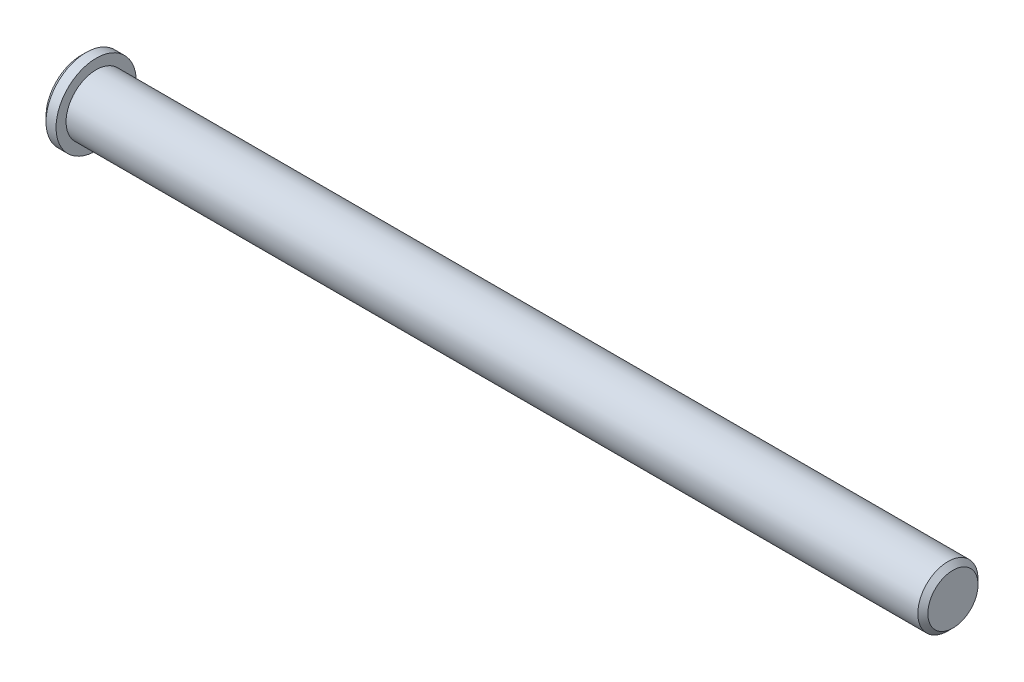
ISO-10303-21;
HEADER;
FILE_DESCRIPTION(('STEP AP214'),'2;1');
FILE_NAME('part.step','',(''),(''),'','','');
FILE_SCHEMA(('AUTOMOTIVE_DESIGN { 1 0 10303 214 1 1 1 1 }'));
ENDSEC;
DATA;
#1=APPLICATION_CONTEXT('core data for automotive mechanical design processes');
#2=APPLICATION_PROTOCOL_DEFINITION('international standard','automotive_design',2000,#1);
#3=PRODUCT_CONTEXT('',#1,'mechanical');
#4=PRODUCT('Part','Part','',(#3));
#5=PRODUCT_RELATED_PRODUCT_CATEGORY('part','',(#4));
#6=PRODUCT_DEFINITION_FORMATION('','',#4);
#7=PRODUCT_DEFINITION_CONTEXT('part definition',#1,'design');
#8=PRODUCT_DEFINITION('design','',#6,#7);
#9=PRODUCT_DEFINITION_SHAPE('','',#8);
#10=(LENGTH_UNIT() NAMED_UNIT(*) SI_UNIT(.MILLI.,.METRE.));
#11=(NAMED_UNIT(*) PLANE_ANGLE_UNIT() SI_UNIT($,.RADIAN.));
#12=(NAMED_UNIT(*) SI_UNIT($,.STERADIAN.) SOLID_ANGLE_UNIT());
#13=UNCERTAINTY_MEASURE_WITH_UNIT(LENGTH_MEASURE(1.E-05),#10,'distance_accuracy_value','');
#14=(GEOMETRIC_REPRESENTATION_CONTEXT(3) GLOBAL_UNCERTAINTY_ASSIGNED_CONTEXT((#13)) GLOBAL_UNIT_ASSIGNED_CONTEXT((#10,
#11,#12)) REPRESENTATION_CONTEXT('',''));
#15=CARTESIAN_POINT('',(0.,0.,0.));
#16=DIRECTION('',(0.,0.,1.));
#17=DIRECTION('',(1.,0.,0.));
#18=AXIS2_PLACEMENT_3D('',#15,#16,#17);
#19=CARTESIAN_POINT('',(0.,0.,0.));
#20=DIRECTION('',(-1.,0.,0.));
#21=DIRECTION('',(0.,-1.,0.));
#22=AXIS2_PLACEMENT_3D('',#19,#20,#21);
#23=PLANE('',#22);
#24=CARTESIAN_POINT('',(0.,0.,0.));
#25=DIRECTION('',(-1.,0.,0.));
#26=DIRECTION('',(0.,-1.,0.));
#27=AXIS2_PLACEMENT_3D('',#24,#25,#26);
#28=CIRCLE('',#27,7.00000000000001);
#29=CARTESIAN_POINT('',(0.,-7.00000000000001,0.));
#30=VERTEX_POINT('',#29);
#31=EDGE_CURVE('E168',#30,#30,#28,.T.);
#32=ORIENTED_EDGE('',*,*,#31,.T.);
#33=EDGE_LOOP('',(#32));
#34=FACE_BOUND('',#33,.T.);
#35=DIRECTION('',(0.,0.5,-0.866025403784439));
#36=VECTOR('',#35,1.);
#37=CARTESIAN_POINT('',(0.,2.5,4.33012701892219));
#38=LINE('',#37,#36);
#39=CARTESIAN_POINT('',(0.,2.5,4.33012701892219));
#40=VERTEX_POINT('',#39);
#41=CARTESIAN_POINT('',(0.,5.,0.));
#42=VERTEX_POINT('',#41);
#43=EDGE_CURVE('E67',#40,#42,#38,.T.);
#44=ORIENTED_EDGE('',*,*,#43,.F.);
#45=DIRECTION('',(0.,1.,0.));
#46=VECTOR('',#45,1.);
#47=CARTESIAN_POINT('',(0.,-2.5,4.33012701892219));
#48=LINE('',#47,#46);
#49=CARTESIAN_POINT('',(0.,-2.5,4.33012701892219));
#50=VERTEX_POINT('',#49);
#51=EDGE_CURVE('E150',#50,#40,#48,.T.);
#52=ORIENTED_EDGE('',*,*,#51,.F.);
#53=DIRECTION('',(0.,0.5,0.866025403784439));
#54=VECTOR('',#53,1.);
#55=CARTESIAN_POINT('',(0.,-5.,0.));
#56=LINE('',#55,#54);
#57=CARTESIAN_POINT('',(0.,-5.,0.));
#58=VERTEX_POINT('',#57);
#59=EDGE_CURVE('E148',#58,#50,#56,.T.);
#60=ORIENTED_EDGE('',*,*,#59,.F.);
#61=DIRECTION('',(0.,-0.5,0.866025403784439));
#62=VECTOR('',#61,1.);
#63=CARTESIAN_POINT('',(0.,-2.5,-4.3301270189222));
#64=LINE('',#63,#62);
#65=CARTESIAN_POINT('',(0.,-2.5,-4.3301270189222));
#66=VERTEX_POINT('',#65);
#67=EDGE_CURVE('E115',#66,#58,#64,.T.);
#68=ORIENTED_EDGE('',*,*,#67,.F.);
#69=DIRECTION('',(0.,-1.,0.));
#70=VECTOR('',#69,1.);
#71=CARTESIAN_POINT('',(0.,2.5,-4.33012701892219));
#72=LINE('',#71,#70);
#73=CARTESIAN_POINT('',(0.,2.5,-4.33012701892219));
#74=VERTEX_POINT('',#73);
#75=EDGE_CURVE('E144',#74,#66,#72,.T.);
#76=ORIENTED_EDGE('',*,*,#75,.F.);
#77=DIRECTION('',(0.,-0.5,-0.866025403784439));
#78=VECTOR('',#77,1.);
#79=CARTESIAN_POINT('',(0.,5.,0.));
#80=LINE('',#79,#78);
#81=EDGE_CURVE('E141',#42,#74,#80,.T.);
#82=ORIENTED_EDGE('',*,*,#81,.F.);
#83=EDGE_LOOP('',(#44,#52,#60,#68,#76,#82));
#84=FACE_BOUND('',#83,.T.);
#85=ADVANCED_FACE('F51',(#34,#84),#23,.T.);
#86=CARTESIAN_POINT('',(173.8,0.,0.));
#87=DIRECTION('',(1.,0.,0.));
#88=DIRECTION('',(0.,1.,0.));
#89=AXIS2_PLACEMENT_3D('',#86,#87,#88);
#90=CYLINDRICAL_SURFACE('',#89,8.);
#91=CARTESIAN_POINT('',(1.,0.,0.));
#92=DIRECTION('',(-1.,0.,0.));
#93=DIRECTION('',(0.,-1.,0.));
#94=AXIS2_PLACEMENT_3D('',#91,#92,#93);
#95=CIRCLE('',#94,8.);
#96=CARTESIAN_POINT('',(1.,-8.,0.));
#97=VERTEX_POINT('',#96);
#98=EDGE_CURVE('E165',#97,#97,#95,.F.);
#99=ORIENTED_EDGE('',*,*,#98,.T.);
#100=EDGE_LOOP('',(#99));
#101=FACE_BOUND('',#100,.T.);
#102=CARTESIAN_POINT('',(3.,0.,0.));
#103=DIRECTION('',(1.,0.,0.));
#104=DIRECTION('',(0.,1.,0.));
#105=AXIS2_PLACEMENT_3D('',#102,#103,#104);
#106=CIRCLE('',#105,8.);
#107=CARTESIAN_POINT('',(3.,8.,0.));
#108=VERTEX_POINT('',#107);
#109=EDGE_CURVE('E162',#108,#108,#106,.T.);
#110=ORIENTED_EDGE('',*,*,#109,.F.);
#111=EDGE_LOOP('',(#110));
#112=FACE_BOUND('',#111,.T.);
#113=ADVANCED_FACE('F185',(#101,#112),#90,.T.);
#114=CARTESIAN_POINT('',(3.,5.99999999999999,0.));
#115=DIRECTION('',(1.,0.,0.));
#116=DIRECTION('',(0.,1.,0.));
#117=AXIS2_PLACEMENT_3D('',#114,#115,#116);
#118=PLANE('',#117);
#119=ORIENTED_EDGE('',*,*,#109,.T.);
#120=EDGE_LOOP('',(#119));
#121=FACE_BOUND('',#120,.T.);
#122=CARTESIAN_POINT('',(3.,0.,0.));
#123=DIRECTION('',(1.,0.,0.));
#124=DIRECTION('',(0.,1.,0.));
#125=AXIS2_PLACEMENT_3D('',#122,#123,#124);
#126=CIRCLE('',#125,5.99999999999999);
#127=CARTESIAN_POINT('',(3.,5.99999999999999,0.));
#128=VERTEX_POINT('',#127);
#129=EDGE_CURVE('E154',#128,#128,#126,.T.);
#130=ORIENTED_EDGE('',*,*,#129,.F.);
#131=EDGE_LOOP('',(#130));
#132=FACE_BOUND('',#131,.T.);
#133=ADVANCED_FACE('F192',(#121,#132),#118,.T.);
#134=CARTESIAN_POINT('',(173.8,0.,0.));
#135=DIRECTION('',(1.,0.,0.));
#136=DIRECTION('',(0.,1.,0.));
#137=AXIS2_PLACEMENT_3D('',#134,#135,#136);
#138=CYLINDRICAL_SURFACE('',#137,5.99999999999998);
#139=CARTESIAN_POINT('',(172.8,0.,0.));
#140=DIRECTION('',(1.,0.,0.));
#141=DIRECTION('',(0.,1.,0.));
#142=AXIS2_PLACEMENT_3D('',#139,#140,#141);
#143=CIRCLE('',#142,5.99999999999998);
#144=CARTESIAN_POINT('',(172.8,5.99999999999999,0.));
#145=VERTEX_POINT('',#144);
#146=EDGE_CURVE('E11',#145,#145,#143,.F.);
#147=ORIENTED_EDGE('',*,*,#146,.T.);
#148=EDGE_LOOP('',(#147));
#149=FACE_BOUND('',#148,.T.);
#150=ORIENTED_EDGE('',*,*,#129,.T.);
#151=EDGE_LOOP('',(#150));
#152=FACE_BOUND('',#151,.T.);
#153=ADVANCED_FACE('F204',(#149,#152),#138,.T.);
#154=CARTESIAN_POINT('',(173.8,5.99999999999998,0.));
#155=DIRECTION('',(1.,0.,0.));
#156=DIRECTION('',(0.,1.,0.));
#157=AXIS2_PLACEMENT_3D('',#154,#155,#156);
#158=PLANE('',#157);
#159=CARTESIAN_POINT('',(173.8,0.,0.));
#160=DIRECTION('',(1.,0.,0.));
#161=DIRECTION('',(0.,1.,0.));
#162=AXIS2_PLACEMENT_3D('',#159,#160,#161);
#163=CIRCLE('',#162,5.00000000000001);
#164=CARTESIAN_POINT('',(173.8,5.00000000000001,0.));
#165=VERTEX_POINT('',#164);
#166=EDGE_CURVE('E60',#165,#165,#163,.T.);
#167=ORIENTED_EDGE('',*,*,#166,.T.);
#168=EDGE_LOOP('',(#167));
#169=FACE_BOUND('',#168,.T.);
#170=ADVANCED_FACE('F173',(#169),#158,.T.);
#171=CARTESIAN_POINT('',(4.,2.5,4.33012701892219));
#172=DIRECTION('',(0.,0.866025403784439,0.5));
#173=DIRECTION('',(0.,-0.5,0.866025403784439));
#174=AXIS2_PLACEMENT_3D('',#171,#172,#173);
#175=PLANE('',#174);
#176=ORIENTED_EDGE('',*,*,#43,.T.);
#177=DIRECTION('',(-1.,0.,0.));
#178=VECTOR('',#177,1.);
#179=CARTESIAN_POINT('',(4.,5.,0.));
#180=LINE('',#179,#178);
#181=CARTESIAN_POINT('',(4.,5.,0.));
#182=VERTEX_POINT('',#181);
#183=EDGE_CURVE('E97',#182,#42,#180,.T.);
#184=ORIENTED_EDGE('',*,*,#183,.F.);
#185=DIRECTION('',(0.,0.5,-0.866025403784439));
#186=VECTOR('',#185,1.);
#187=CARTESIAN_POINT('',(4.,2.5,4.33012701892219));
#188=LINE('',#187,#186);
#189=CARTESIAN_POINT('',(4.,2.5,4.33012701892219));
#190=VERTEX_POINT('',#189);
#191=EDGE_CURVE('E152',#190,#182,#188,.T.);
#192=ORIENTED_EDGE('',*,*,#191,.F.);
#193=DIRECTION('',(-1.,0.,0.));
#194=VECTOR('',#193,1.);
#195=CARTESIAN_POINT('',(4.,2.5,4.33012701892219));
#196=LINE('',#195,#194);
#197=EDGE_CURVE('E75',#190,#40,#196,.T.);
#198=ORIENTED_EDGE('',*,*,#197,.T.);
#199=EDGE_LOOP('',(#176,#184,#192,#198));
#200=FACE_BOUND('',#199,.T.);
#201=ADVANCED_FACE('F210',(#200),#175,.F.);
#202=CARTESIAN_POINT('',(4.,-2.5,4.33012701892219));
#203=DIRECTION('',(0.,0.,1.));
#204=DIRECTION('',(0.,-1.,0.));
#205=AXIS2_PLACEMENT_3D('',#202,#203,#204);
#206=PLANE('',#205);
#207=ORIENTED_EDGE('',*,*,#51,.T.);
#208=ORIENTED_EDGE('',*,*,#197,.F.);
#209=DIRECTION('',(0.,1.,0.));
#210=VECTOR('',#209,1.);
#211=CARTESIAN_POINT('',(4.,-2.5,4.33012701892219));
#212=LINE('',#211,#210);
#213=CARTESIAN_POINT('',(4.,-2.5,4.33012701892219));
#214=VERTEX_POINT('',#213);
#215=EDGE_CURVE('E127',#214,#190,#212,.T.);
#216=ORIENTED_EDGE('',*,*,#215,.F.);
#217=DIRECTION('',(-1.,0.,0.));
#218=VECTOR('',#217,1.);
#219=CARTESIAN_POINT('',(4.,-2.5,4.33012701892219));
#220=LINE('',#219,#218);
#221=EDGE_CURVE('E119',#214,#50,#220,.T.);
#222=ORIENTED_EDGE('',*,*,#221,.T.);
#223=EDGE_LOOP('',(#207,#208,#216,#222));
#224=FACE_BOUND('',#223,.T.);
#225=ADVANCED_FACE('F213',(#224),#206,.F.);
#226=CARTESIAN_POINT('',(4.,-5.,0.));
#227=DIRECTION('',(0.,-0.866025403784439,0.5));
#228=DIRECTION('',(0.,-0.5,-0.866025403784439));
#229=AXIS2_PLACEMENT_3D('',#226,#227,#228);
#230=PLANE('',#229);
#231=ORIENTED_EDGE('',*,*,#59,.T.);
#232=ORIENTED_EDGE('',*,*,#221,.F.);
#233=DIRECTION('',(0.,0.5,0.866025403784439));
#234=VECTOR('',#233,1.);
#235=CARTESIAN_POINT('',(4.,-5.,0.));
#236=LINE('',#235,#234);
#237=CARTESIAN_POINT('',(4.,-5.,0.));
#238=VERTEX_POINT('',#237);
#239=EDGE_CURVE('E123',#238,#214,#236,.T.);
#240=ORIENTED_EDGE('',*,*,#239,.F.);
#241=DIRECTION('',(-1.,0.,0.));
#242=VECTOR('',#241,1.);
#243=CARTESIAN_POINT('',(4.,-5.,0.));
#244=LINE('',#243,#242);
#245=EDGE_CURVE('E108',#238,#58,#244,.T.);
#246=ORIENTED_EDGE('',*,*,#245,.T.);
#247=EDGE_LOOP('',(#231,#232,#240,#246));
#248=FACE_BOUND('',#247,.T.);
#249=ADVANCED_FACE('F124',(#248),#230,.F.);
#250=CARTESIAN_POINT('',(4.,-2.5,-4.3301270189222));
#251=DIRECTION('',(0.,-0.866025403784439,-0.5));
#252=DIRECTION('',(0.,0.5,-0.866025403784439));
#253=AXIS2_PLACEMENT_3D('',#250,#251,#252);
#254=PLANE('',#253);
#255=ORIENTED_EDGE('',*,*,#67,.T.);
#256=ORIENTED_EDGE('',*,*,#245,.F.);
#257=DIRECTION('',(0.,-0.5,0.866025403784439));
#258=VECTOR('',#257,1.);
#259=CARTESIAN_POINT('',(4.,-2.5,-4.3301270189222));
#260=LINE('',#259,#258);
#261=CARTESIAN_POINT('',(4.,-2.5,-4.3301270189222));
#262=VERTEX_POINT('',#261);
#263=EDGE_CURVE('E112',#262,#238,#260,.T.);
#264=ORIENTED_EDGE('',*,*,#263,.F.);
#265=DIRECTION('',(-1.,0.,0.));
#266=VECTOR('',#265,1.);
#267=CARTESIAN_POINT('',(4.,-2.5,-4.3301270189222));
#268=LINE('',#267,#266);
#269=EDGE_CURVE('E120',#262,#66,#268,.T.);
#270=ORIENTED_EDGE('',*,*,#269,.T.);
#271=EDGE_LOOP('',(#255,#256,#264,#270));
#272=FACE_BOUND('',#271,.T.);
#273=ADVANCED_FACE('F110',(#272),#254,.F.);
#274=CARTESIAN_POINT('',(4.,2.5,-4.33012701892219));
#275=DIRECTION('',(0.,0.,-1.));
#276=DIRECTION('',(0.,1.,0.));
#277=AXIS2_PLACEMENT_3D('',#274,#275,#276);
#278=PLANE('',#277);
#279=ORIENTED_EDGE('',*,*,#75,.T.);
#280=ORIENTED_EDGE('',*,*,#269,.F.);
#281=DIRECTION('',(0.,-1.,0.));
#282=VECTOR('',#281,1.);
#283=CARTESIAN_POINT('',(4.,2.5,-4.33012701892219));
#284=LINE('',#283,#282);
#285=CARTESIAN_POINT('',(4.,2.5,-4.33012701892219));
#286=VERTEX_POINT('',#285);
#287=EDGE_CURVE('E133',#286,#262,#284,.T.);
#288=ORIENTED_EDGE('',*,*,#287,.F.);
#289=DIRECTION('',(-1.,0.,0.));
#290=VECTOR('',#289,1.);
#291=CARTESIAN_POINT('',(4.,2.5,-4.33012701892219));
#292=LINE('',#291,#290);
#293=EDGE_CURVE('E157',#286,#74,#292,.T.);
#294=ORIENTED_EDGE('',*,*,#293,.T.);
#295=EDGE_LOOP('',(#279,#280,#288,#294));
#296=FACE_BOUND('',#295,.T.);
#297=ADVANCED_FACE('F217',(#296),#278,.F.);
#298=CARTESIAN_POINT('',(4.,5.,0.));
#299=DIRECTION('',(0.,0.866025403784439,-0.5));
#300=DIRECTION('',(0.,0.5,0.866025403784439));
#301=AXIS2_PLACEMENT_3D('',#298,#299,#300);
#302=PLANE('',#301);
#303=ORIENTED_EDGE('',*,*,#81,.T.);
#304=ORIENTED_EDGE('',*,*,#293,.F.);
#305=DIRECTION('',(0.,-0.5,-0.866025403784439));
#306=VECTOR('',#305,1.);
#307=CARTESIAN_POINT('',(4.,5.,0.));
#308=LINE('',#307,#306);
#309=EDGE_CURVE('E135',#182,#286,#308,.T.);
#310=ORIENTED_EDGE('',*,*,#309,.F.);
#311=ORIENTED_EDGE('',*,*,#183,.T.);
#312=EDGE_LOOP('',(#303,#304,#310,#311));
#313=FACE_BOUND('',#312,.T.);
#314=ADVANCED_FACE('F214',(#313),#302,.F.);
#315=CARTESIAN_POINT('',(4.,0.,0.));
#316=DIRECTION('',(-1.,0.,0.));
#317=DIRECTION('',(0.,-1.,0.));
#318=AXIS2_PLACEMENT_3D('',#315,#316,#317);
#319=PLANE('',#318);
#320=ORIENTED_EDGE('',*,*,#191,.T.);
#321=ORIENTED_EDGE('',*,*,#309,.T.);
#322=ORIENTED_EDGE('',*,*,#287,.T.);
#323=ORIENTED_EDGE('',*,*,#263,.T.);
#324=ORIENTED_EDGE('',*,*,#239,.T.);
#325=ORIENTED_EDGE('',*,*,#215,.T.);
#326=EDGE_LOOP('',(#320,#321,#322,#323,#324,#325));
#327=FACE_BOUND('',#326,.T.);
#328=ADVANCED_FACE('F130',(#327),#319,.T.);
#329=CARTESIAN_POINT('',(1.,0.,0.));
#330=DIRECTION('',(1.,0.,0.));
#331=DIRECTION('',(0.,1.,0.));
#332=AXIS2_PLACEMENT_3D('',#329,#330,#331);
#333=CONICAL_SURFACE('',#332,8.,0.785398163397445);
#334=ORIENTED_EDGE('',*,*,#31,.F.);
#335=EDGE_LOOP('',(#334));
#336=FACE_BOUND('',#335,.T.);
#337=ORIENTED_EDGE('',*,*,#98,.F.);
#338=EDGE_LOOP('',(#337));
#339=FACE_BOUND('',#338,.T.);
#340=ADVANCED_FACE('F176',(#336,#339),#333,.T.);
#341=CARTESIAN_POINT('',(173.8,0.,0.));
#342=DIRECTION('',(-1.,0.,0.));
#343=DIRECTION('',(0.,-1.,0.));
#344=AXIS2_PLACEMENT_3D('',#341,#342,#343);
#345=CONICAL_SURFACE('',#344,5.00000000000001,0.785398163397437);
#346=ORIENTED_EDGE('',*,*,#146,.F.);
#347=EDGE_LOOP('',(#346));
#348=FACE_BOUND('',#347,.T.);
#349=ORIENTED_EDGE('',*,*,#166,.F.);
#350=EDGE_LOOP('',(#349));
#351=FACE_BOUND('',#350,.T.);
#352=ADVANCED_FACE('F54',(#348,#351),#345,.T.);
#353=CLOSED_SHELL('',(#85,#113,#133,#153,#170,#201,#225,#249,#273,#297,#314,#328,#340,#352));
#354=MANIFOLD_SOLID_BREP('B2',#353);
#355=ADVANCED_BREP_SHAPE_REPRESENTATION('',(#18,#354),#14);
#356=SHAPE_DEFINITION_REPRESENTATION(#9,#355);
ENDSEC;
END-ISO-10303-21;
